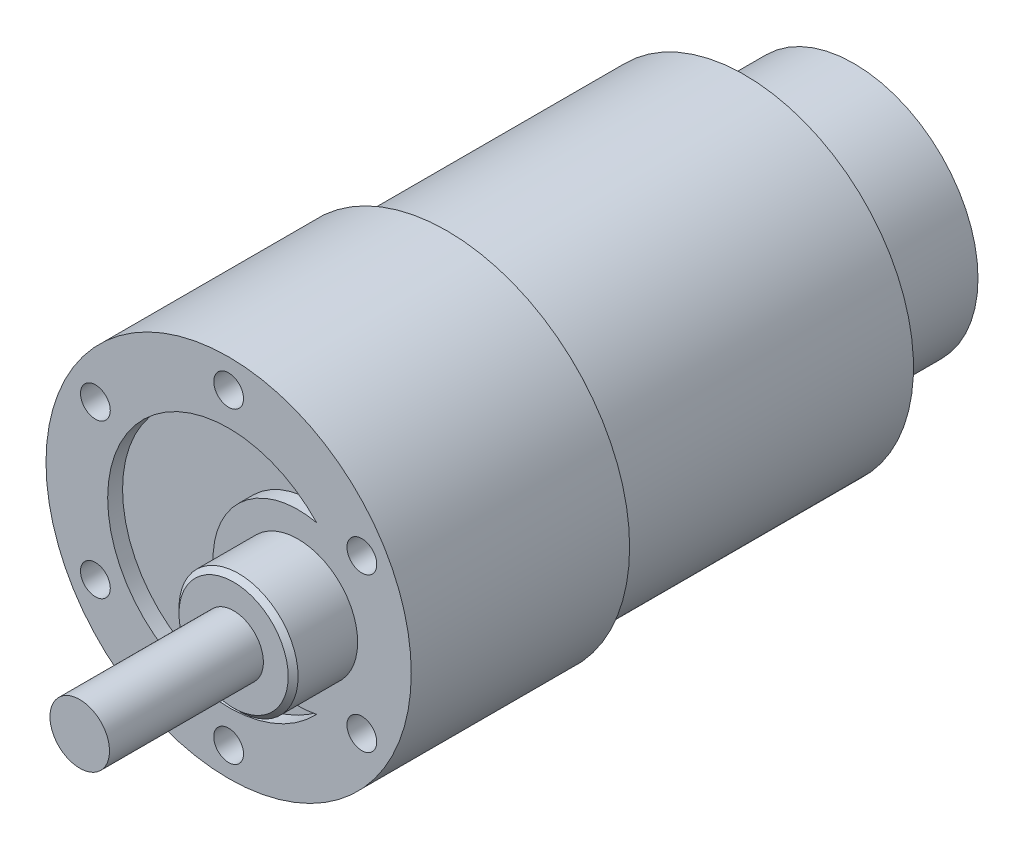
ISO-10303-21;
HEADER;
FILE_DESCRIPTION(('STEP AP214'),'2;1');
FILE_NAME('part.step','',(''),(''),'','','');
FILE_SCHEMA(('AUTOMOTIVE_DESIGN { 1 0 10303 214 1 1 1 1 }'));
ENDSEC;
DATA;
#1=APPLICATION_CONTEXT('core data for automotive mechanical design processes');
#2=APPLICATION_PROTOCOL_DEFINITION('international standard','automotive_design',2000,#1);
#3=PRODUCT_CONTEXT('',#1,'mechanical');
#4=PRODUCT('Part','Part','',(#3));
#5=PRODUCT_RELATED_PRODUCT_CATEGORY('part','',(#4));
#6=PRODUCT_DEFINITION_FORMATION('','',#4);
#7=PRODUCT_DEFINITION_CONTEXT('part definition',#1,'design');
#8=PRODUCT_DEFINITION('design','',#6,#7);
#9=PRODUCT_DEFINITION_SHAPE('','',#8);
#10=(LENGTH_UNIT() NAMED_UNIT(*) SI_UNIT(.MILLI.,.METRE.));
#11=(NAMED_UNIT(*) PLANE_ANGLE_UNIT() SI_UNIT($,.RADIAN.));
#12=(NAMED_UNIT(*) SI_UNIT($,.STERADIAN.) SOLID_ANGLE_UNIT());
#13=UNCERTAINTY_MEASURE_WITH_UNIT(LENGTH_MEASURE(1.E-05),#10,'distance_accuracy_value','');
#14=(GEOMETRIC_REPRESENTATION_CONTEXT(3) GLOBAL_UNCERTAINTY_ASSIGNED_CONTEXT((#13)) GLOBAL_UNIT_ASSIGNED_CONTEXT((#10,
#11,#12)) REPRESENTATION_CONTEXT('',''));
#15=CARTESIAN_POINT('',(0.,0.,0.));
#16=DIRECTION('',(0.,0.,1.));
#17=DIRECTION('',(1.,0.,0.));
#18=AXIS2_PLACEMENT_3D('',#15,#16,#17);
#19=CARTESIAN_POINT('',(0.,0.,0.));
#20=DIRECTION('',(0.,0.,-1.));
#21=DIRECTION('',(-1.,0.,0.));
#22=AXIS2_PLACEMENT_3D('',#19,#20,#21);
#23=PLANE('',#22);
#24=CARTESIAN_POINT('',(0.,0.,0.));
#25=DIRECTION('',(0.,0.,-1.));
#26=DIRECTION('',(-1.,0.,0.));
#27=AXIS2_PLACEMENT_3D('',#24,#25,#26);
#28=CIRCLE('',#27,17.);
#29=CARTESIAN_POINT('',(-17.,0.,0.));
#30=VERTEX_POINT('',#29);
#31=EDGE_CURVE('E88',#30,#30,#28,.T.);
#32=ORIENTED_EDGE('',*,*,#31,.T.);
#33=EDGE_LOOP('',(#32));
#34=FACE_BOUND('',#33,.T.);
#35=CARTESIAN_POINT('',(0.,0.,0.));
#36=DIRECTION('',(0.,0.,-1.));
#37=DIRECTION('',(-1.,0.,0.));
#38=AXIS2_PLACEMENT_3D('',#35,#36,#37);
#39=CIRCLE('',#38,12.5);
#40=CARTESIAN_POINT('',(-12.5,0.,0.));
#41=VERTEX_POINT('',#40);
#42=EDGE_CURVE('E65',#41,#41,#39,.T.);
#43=ORIENTED_EDGE('',*,*,#42,.F.);
#44=EDGE_LOOP('',(#43));
#45=FACE_BOUND('',#44,.T.);
#46=ADVANCED_FACE('F34',(#34,#45),#23,.T.);
#47=CARTESIAN_POINT('',(0.,0.,52.));
#48=DIRECTION('',(0.,0.,-1.));
#49=DIRECTION('',(-1.,0.,0.));
#50=AXIS2_PLACEMENT_3D('',#47,#48,#49);
#51=CYLINDRICAL_SURFACE('',#50,18.4);
#52=CARTESIAN_POINT('',(0.,0.,52.));
#53=DIRECTION('',(0.,0.,-1.));
#54=DIRECTION('',(-1.,0.,0.));
#55=AXIS2_PLACEMENT_3D('',#52,#53,#54);
#56=CIRCLE('',#55,18.4);
#57=CARTESIAN_POINT('',(-18.4,0.,52.));
#58=VERTEX_POINT('',#57);
#59=EDGE_CURVE('E102',#58,#58,#56,.T.);
#60=ORIENTED_EDGE('',*,*,#59,.T.);
#61=EDGE_LOOP('',(#60));
#62=FACE_BOUND('',#61,.T.);
#63=CARTESIAN_POINT('',(0.,0.,30.));
#64=DIRECTION('',(0.,0.,-1.));
#65=DIRECTION('',(-1.,0.,0.));
#66=AXIS2_PLACEMENT_3D('',#63,#64,#65);
#67=CIRCLE('',#66,18.4);
#68=CARTESIAN_POINT('',(-18.4,0.,30.));
#69=VERTEX_POINT('',#68);
#70=EDGE_CURVE('E93',#69,#69,#67,.T.);
#71=ORIENTED_EDGE('',*,*,#70,.F.);
#72=EDGE_LOOP('',(#71));
#73=FACE_BOUND('',#72,.T.);
#74=ADVANCED_FACE('F124',(#62,#73),#51,.T.);
#75=CARTESIAN_POINT('',(18.4,0.,52.));
#76=DIRECTION('',(0.,0.,1.));
#77=DIRECTION('',(1.,0.,0.));
#78=AXIS2_PLACEMENT_3D('',#75,#76,#77);
#79=PLANE('',#78);
#80=CARTESIAN_POINT('',(-13.4233937586587,7.75000000000016,52.));
#81=DIRECTION('',(0.,0.,1.));
#82=DIRECTION('',(1.,0.,0.));
#83=AXIS2_PLACEMENT_3D('',#80,#81,#82);
#84=CIRCLE('',#83,1.49999999999999);
#85=CARTESIAN_POINT('',(-11.9233937586587,7.75000000000016,52.));
#86=VERTEX_POINT('',#85);
#87=EDGE_CURVE('E155',#86,#86,#84,.T.);
#88=ORIENTED_EDGE('',*,*,#87,.F.);
#89=EDGE_LOOP('',(#88));
#90=FACE_BOUND('',#89,.T.);
#91=CARTESIAN_POINT('',(-13.4233937586589,-7.74999999999987,52.));
#92=DIRECTION('',(0.,0.,1.));
#93=DIRECTION('',(1.,0.,0.));
#94=AXIS2_PLACEMENT_3D('',#91,#92,#93);
#95=CIRCLE('',#94,1.49999999999999);
#96=CARTESIAN_POINT('',(-11.9233937586589,-7.74999999999987,52.));
#97=VERTEX_POINT('',#96);
#98=EDGE_CURVE('E159',#97,#97,#95,.T.);
#99=ORIENTED_EDGE('',*,*,#98,.F.);
#100=EDGE_LOOP('',(#99));
#101=FACE_BOUND('',#100,.T.);
#102=CARTESIAN_POINT('',(-1.08235921504137E-13,-15.5,52.));
#103=DIRECTION('',(0.,0.,1.));
#104=DIRECTION('',(1.,0.,0.));
#105=AXIS2_PLACEMENT_3D('',#102,#103,#104);
#106=CIRCLE('',#105,1.49999999999999);
#107=CARTESIAN_POINT('',(1.49999999999988,-15.5,52.));
#108=VERTEX_POINT('',#107);
#109=EDGE_CURVE('E163',#108,#108,#106,.T.);
#110=ORIENTED_EDGE('',*,*,#109,.F.);
#111=EDGE_LOOP('',(#110));
#112=FACE_BOUND('',#111,.T.);
#113=CARTESIAN_POINT('',(13.4233937586588,-7.75000000000006,52.));
#114=DIRECTION('',(0.,0.,1.));
#115=DIRECTION('',(1.,0.,0.));
#116=AXIS2_PLACEMENT_3D('',#113,#114,#115);
#117=CIRCLE('',#116,1.49999999999999);
#118=CARTESIAN_POINT('',(14.9233937586588,-7.75000000000006,52.));
#119=VERTEX_POINT('',#118);
#120=EDGE_CURVE('E167',#119,#119,#117,.T.);
#121=ORIENTED_EDGE('',*,*,#120,.F.);
#122=EDGE_LOOP('',(#121));
#123=FACE_BOUND('',#122,.T.);
#124=CARTESIAN_POINT('',(13.4233937586588,7.74999999999997,52.));
#125=DIRECTION('',(0.,0.,1.));
#126=DIRECTION('',(1.,0.,0.));
#127=AXIS2_PLACEMENT_3D('',#124,#125,#126);
#128=CIRCLE('',#127,1.49999999999999);
#129=CARTESIAN_POINT('',(14.9233937586588,7.74999999999997,52.));
#130=VERTEX_POINT('',#129);
#131=EDGE_CURVE('E171',#130,#130,#128,.T.);
#132=ORIENTED_EDGE('',*,*,#131,.F.);
#133=EDGE_LOOP('',(#132));
#134=FACE_BOUND('',#133,.T.);
#135=CARTESIAN_POINT('',(0.,15.5,52.));
#136=DIRECTION('',(0.,0.,1.));
#137=DIRECTION('',(1.,0.,0.));
#138=AXIS2_PLACEMENT_3D('',#135,#136,#137);
#139=CIRCLE('',#138,1.49999999999999);
#140=CARTESIAN_POINT('',(1.49999999999999,15.5,52.));
#141=VERTEX_POINT('',#140);
#142=EDGE_CURVE('E175',#141,#141,#139,.T.);
#143=ORIENTED_EDGE('',*,*,#142,.F.);
#144=EDGE_LOOP('',(#143));
#145=FACE_BOUND('',#144,.T.);
#146=CARTESIAN_POINT('',(7.,0.,52.));
#147=DIRECTION('',(0.,0.,1.));
#148=DIRECTION('',(1.,0.,0.));
#149=AXIS2_PLACEMENT_3D('',#146,#147,#148);
#150=CIRCLE('',#149,6.);
#151=CARTESIAN_POINT('',(13.,0.,52.));
#152=VERTEX_POINT('',#151);
#153=EDGE_CURVE('E105',#152,#152,#150,.T.);
#154=ORIENTED_EDGE('',*,*,#153,.F.);
#155=EDGE_LOOP('',(#154));
#156=FACE_BOUND('',#155,.T.);
#157=CARTESIAN_POINT('',(7.,0.,52.));
#158=DIRECTION('',(0.,0.,-1.));
#159=DIRECTION('',(-1.,0.,0.));
#160=AXIS2_PLACEMENT_3D('',#157,#158,#159);
#161=CIRCLE('',#160,8.56590718111272);
#162=CARTESIAN_POINT('',(8.86813473528428,-8.35971521322723,52.));
#163=VERTEX_POINT('',#162);
#164=CARTESIAN_POINT('',(8.86813473528428,8.35971521322723,52.));
#165=VERTEX_POINT('',#164);
#166=EDGE_CURVE('E49',#163,#165,#161,.T.);
#167=ORIENTED_EDGE('',*,*,#166,.F.);
#168=CARTESIAN_POINT('',(0.,0.,52.));
#169=DIRECTION('',(0.,0.,1.));
#170=DIRECTION('',(1.,0.,0.));
#171=AXIS2_PLACEMENT_3D('',#168,#169,#170);
#172=CIRCLE('',#171,12.1872331613627);
#173=EDGE_CURVE('E69',#165,#163,#172,.T.);
#174=ORIENTED_EDGE('',*,*,#173,.F.);
#175=EDGE_LOOP('',(#167,#174));
#176=FACE_BOUND('',#175,.T.);
#177=ORIENTED_EDGE('',*,*,#59,.F.);
#178=EDGE_LOOP('',(#177));
#179=FACE_BOUND('',#178,.T.);
#180=ADVANCED_FACE('F73',(#90,#101,#112,#123,#134,#145,#156,#176,#179),#79,.T.);
#181=CARTESIAN_POINT('',(0.,0.,29.));
#182=DIRECTION('',(0.,0.,-1.));
#183=DIRECTION('',(-1.,0.,0.));
#184=AXIS2_PLACEMENT_3D('',#181,#182,#183);
#185=TOROIDAL_SURFACE('',#184,16.,1.);
#186=CARTESIAN_POINT('',(0.,0.,30.));
#187=DIRECTION('',(0.,0.,-1.));
#188=DIRECTION('',(-1.,0.,0.));
#189=AXIS2_PLACEMENT_3D('',#186,#187,#188);
#190=CIRCLE('',#189,16.);
#191=CARTESIAN_POINT('',(-16.,0.,30.));
#192=VERTEX_POINT('',#191);
#193=EDGE_CURVE('E96',#192,#192,#190,.T.);
#194=ORIENTED_EDGE('',*,*,#193,.T.);
#195=EDGE_LOOP('',(#194));
#196=FACE_BOUND('',#195,.T.);
#197=CARTESIAN_POINT('',(0.,0.,29.));
#198=DIRECTION('',(0.,0.,-1.));
#199=DIRECTION('',(-1.,0.,0.));
#200=AXIS2_PLACEMENT_3D('',#197,#198,#199);
#201=CIRCLE('',#200,17.);
#202=CARTESIAN_POINT('',(-17.,0.,29.));
#203=VERTEX_POINT('',#202);
#204=EDGE_CURVE('E99',#203,#203,#201,.T.);
#205=ORIENTED_EDGE('',*,*,#204,.F.);
#206=EDGE_LOOP('',(#205));
#207=FACE_BOUND('',#206,.T.);
#208=ADVANCED_FACE('F143',(#196,#207),#185,.T.);
#209=CARTESIAN_POINT('',(16.,0.,30.));
#210=DIRECTION('',(0.,0.,-1.));
#211=DIRECTION('',(-1.,0.,0.));
#212=AXIS2_PLACEMENT_3D('',#209,#210,#211);
#213=PLANE('',#212);
#214=ORIENTED_EDGE('',*,*,#70,.T.);
#215=EDGE_LOOP('',(#214));
#216=FACE_BOUND('',#215,.T.);
#217=ORIENTED_EDGE('',*,*,#193,.F.);
#218=EDGE_LOOP('',(#217));
#219=FACE_BOUND('',#218,.T.);
#220=ADVANCED_FACE('F139',(#216,#219),#213,.T.);
#221=CARTESIAN_POINT('',(0.,0.,0.));
#222=DIRECTION('',(0.,0.,1.));
#223=DIRECTION('',(1.,0.,0.));
#224=AXIS2_PLACEMENT_3D('',#221,#222,#223);
#225=CYLINDRICAL_SURFACE('',#224,17.);
#226=ORIENTED_EDGE('',*,*,#31,.F.);
#227=EDGE_LOOP('',(#226));
#228=FACE_BOUND('',#227,.T.);
#229=ORIENTED_EDGE('',*,*,#204,.T.);
#230=EDGE_LOOP('',(#229));
#231=FACE_BOUND('',#230,.T.);
#232=ADVANCED_FACE('F136',(#228,#231),#225,.T.);
#233=CARTESIAN_POINT('',(0.,0.,-11.));
#234=DIRECTION('',(0.,0.,1.));
#235=DIRECTION('',(1.,0.,0.));
#236=AXIS2_PLACEMENT_3D('',#233,#234,#235);
#237=CYLINDRICAL_SURFACE('',#236,12.5);
#238=CARTESIAN_POINT('',(0.,0.,-11.));
#239=DIRECTION('',(0.,0.,-1.));
#240=DIRECTION('',(-1.,0.,0.));
#241=AXIS2_PLACEMENT_3D('',#238,#239,#240);
#242=CIRCLE('',#241,12.5);
#243=CARTESIAN_POINT('',(-12.5,0.,-11.));
#244=VERTEX_POINT('',#243);
#245=EDGE_CURVE('E85',#244,#244,#242,.T.);
#246=ORIENTED_EDGE('',*,*,#245,.F.);
#247=EDGE_LOOP('',(#246));
#248=FACE_BOUND('',#247,.T.);
#249=ORIENTED_EDGE('',*,*,#42,.T.);
#250=EDGE_LOOP('',(#249));
#251=FACE_BOUND('',#250,.T.);
#252=ADVANCED_FACE('F134',(#248,#251),#237,.T.);
#253=CARTESIAN_POINT('',(0.,0.,-11.));
#254=DIRECTION('',(0.,0.,-1.));
#255=DIRECTION('',(-1.,0.,0.));
#256=AXIS2_PLACEMENT_3D('',#253,#254,#255);
#257=PLANE('',#256);
#258=ORIENTED_EDGE('',*,*,#245,.T.);
#259=EDGE_LOOP('',(#258));
#260=FACE_BOUND('',#259,.T.);
#261=ADVANCED_FACE('F203',(#260),#257,.T.);
#262=CARTESIAN_POINT('',(7.,0.,50.5));
#263=DIRECTION('',(0.,0.,1.));
#264=DIRECTION('',(1.,0.,0.));
#265=AXIS2_PLACEMENT_3D('',#262,#263,#264);
#266=CYLINDRICAL_SURFACE('',#265,8.56590718111272);
#267=ORIENTED_EDGE('',*,*,#166,.T.);
#268=DIRECTION('',(0.,0.,1.));
#269=VECTOR('',#268,1.);
#270=CARTESIAN_POINT('',(8.86813473528428,8.35971521322723,50.5));
#271=LINE('',#270,#269);
#272=CARTESIAN_POINT('',(8.86813473528428,8.35971521322723,50.5));
#273=VERTEX_POINT('',#272);
#274=EDGE_CURVE('E66',#273,#165,#271,.T.);
#275=ORIENTED_EDGE('',*,*,#274,.F.);
#276=CARTESIAN_POINT('',(7.,0.,50.5));
#277=DIRECTION('',(0.,0.,-1.));
#278=DIRECTION('',(-1.,0.,0.));
#279=AXIS2_PLACEMENT_3D('',#276,#277,#278);
#280=CIRCLE('',#279,8.56590718111272);
#281=CARTESIAN_POINT('',(8.86813473528428,-8.35971521322723,50.5));
#282=VERTEX_POINT('',#281);
#283=EDGE_CURVE('E63',#282,#273,#280,.T.);
#284=ORIENTED_EDGE('',*,*,#283,.F.);
#285=DIRECTION('',(0.,0.,1.));
#286=VECTOR('',#285,1.);
#287=CARTESIAN_POINT('',(8.86813473528428,-8.35971521322723,50.5));
#288=LINE('',#287,#286);
#289=EDGE_CURVE('E57',#282,#163,#288,.T.);
#290=ORIENTED_EDGE('',*,*,#289,.T.);
#291=EDGE_LOOP('',(#267,#275,#284,#290));
#292=FACE_BOUND('',#291,.T.);
#293=ADVANCED_FACE('F61',(#292),#266,.T.);
#294=CARTESIAN_POINT('',(0.,0.,50.5));
#295=DIRECTION('',(0.,0.,1.));
#296=DIRECTION('',(1.,0.,0.));
#297=AXIS2_PLACEMENT_3D('',#294,#295,#296);
#298=CYLINDRICAL_SURFACE('',#297,12.1872331613627);
#299=ORIENTED_EDGE('',*,*,#173,.T.);
#300=ORIENTED_EDGE('',*,*,#289,.F.);
#301=CARTESIAN_POINT('',(0.,0.,50.5));
#302=DIRECTION('',(0.,0.,1.));
#303=DIRECTION('',(1.,0.,0.));
#304=AXIS2_PLACEMENT_3D('',#301,#302,#303);
#305=CIRCLE('',#304,12.1872331613627);
#306=EDGE_CURVE('E81',#273,#282,#305,.T.);
#307=ORIENTED_EDGE('',*,*,#306,.F.);
#308=ORIENTED_EDGE('',*,*,#274,.T.);
#309=EDGE_LOOP('',(#299,#300,#307,#308));
#310=FACE_BOUND('',#309,.T.);
#311=ADVANCED_FACE('F70',(#310),#298,.F.);
#312=CARTESIAN_POINT('',(3.5,0.,50.5));
#313=DIRECTION('',(0.,0.,-1.));
#314=DIRECTION('',(-1.,0.,0.));
#315=AXIS2_PLACEMENT_3D('',#312,#313,#314);
#316=PLANE('',#315);
#317=ORIENTED_EDGE('',*,*,#283,.T.);
#318=ORIENTED_EDGE('',*,*,#306,.T.);
#319=EDGE_LOOP('',(#317,#318));
#320=FACE_BOUND('',#319,.T.);
#321=ADVANCED_FACE('F195',(#320),#316,.F.);
#322=CARTESIAN_POINT('',(7.,0.,74.));
#323=DIRECTION('',(0.,0.,-1.));
#324=DIRECTION('',(-1.,0.,0.));
#325=AXIS2_PLACEMENT_3D('',#322,#323,#324);
#326=CYLINDRICAL_SURFACE('',#325,3.);
#327=CARTESIAN_POINT('',(7.,0.,74.));
#328=DIRECTION('',(0.,0.,-1.));
#329=DIRECTION('',(-1.,0.,0.));
#330=AXIS2_PLACEMENT_3D('',#327,#328,#329);
#331=CIRCLE('',#330,3.);
#332=CARTESIAN_POINT('',(4.,0.,74.));
#333=VERTEX_POINT('',#332);
#334=EDGE_CURVE('E75',#333,#333,#331,.T.);
#335=ORIENTED_EDGE('',*,*,#334,.T.);
#336=EDGE_LOOP('',(#335));
#337=FACE_BOUND('',#336,.T.);
#338=CARTESIAN_POINT('',(7.,0.,58.5));
#339=DIRECTION('',(0.,0.,-1.));
#340=DIRECTION('',(-1.,0.,0.));
#341=AXIS2_PLACEMENT_3D('',#338,#339,#340);
#342=CIRCLE('',#341,3.);
#343=CARTESIAN_POINT('',(4.,0.,58.5));
#344=VERTEX_POINT('',#343);
#345=EDGE_CURVE('E78',#344,#344,#342,.T.);
#346=ORIENTED_EDGE('',*,*,#345,.F.);
#347=EDGE_LOOP('',(#346));
#348=FACE_BOUND('',#347,.T.);
#349=ADVANCED_FACE('F188',(#337,#348),#326,.T.);
#350=CARTESIAN_POINT('',(10.,0.,74.));
#351=DIRECTION('',(0.,0.,1.));
#352=DIRECTION('',(1.,0.,0.));
#353=AXIS2_PLACEMENT_3D('',#350,#351,#352);
#354=PLANE('',#353);
#355=ORIENTED_EDGE('',*,*,#334,.F.);
#356=EDGE_LOOP('',(#355));
#357=FACE_BOUND('',#356,.T.);
#358=ADVANCED_FACE('F179',(#357),#354,.T.);
#359=CARTESIAN_POINT('',(7.,0.,74.));
#360=DIRECTION('',(0.,0.,-1.));
#361=DIRECTION('',(-1.,0.,0.));
#362=AXIS2_PLACEMENT_3D('',#359,#360,#361);
#363=CYLINDRICAL_SURFACE('',#362,6.);
#364=CARTESIAN_POINT('',(7.,0.,57.9999999999705));
#365=DIRECTION('',(0.,0.,1.));
#366=DIRECTION('',(1.,0.,0.));
#367=AXIS2_PLACEMENT_3D('',#364,#365,#366);
#368=CIRCLE('',#367,6.);
#369=CARTESIAN_POINT('',(13.,0.,57.9999999999705));
#370=VERTEX_POINT('',#369);
#371=EDGE_CURVE('E42',#370,#370,#368,.F.);
#372=ORIENTED_EDGE('',*,*,#371,.T.);
#373=EDGE_LOOP('',(#372));
#374=FACE_BOUND('',#373,.T.);
#375=ORIENTED_EDGE('',*,*,#153,.T.);
#376=EDGE_LOOP('',(#375));
#377=FACE_BOUND('',#376,.T.);
#378=ADVANCED_FACE('F110',(#374,#377),#363,.T.);
#379=CARTESIAN_POINT('',(13.,0.,58.5));
#380=DIRECTION('',(0.,0.,1.));
#381=DIRECTION('',(1.,0.,0.));
#382=AXIS2_PLACEMENT_3D('',#379,#380,#381);
#383=PLANE('',#382);
#384=CARTESIAN_POINT('',(7.,0.,58.5));
#385=DIRECTION('',(0.,0.,1.));
#386=DIRECTION('',(1.,0.,0.));
#387=AXIS2_PLACEMENT_3D('',#384,#385,#386);
#388=CIRCLE('',#387,5.50000000002732);
#389=CARTESIAN_POINT('',(12.5000000000273,0.,58.5));
#390=VERTEX_POINT('',#389);
#391=EDGE_CURVE('E11',#390,#390,#388,.T.);
#392=ORIENTED_EDGE('',*,*,#391,.T.);
#393=EDGE_LOOP('',(#392));
#394=FACE_BOUND('',#393,.T.);
#395=ORIENTED_EDGE('',*,*,#345,.T.);
#396=EDGE_LOOP('',(#395));
#397=FACE_BOUND('',#396,.T.);
#398=ADVANCED_FACE('F178',(#394,#397),#383,.T.);
#399=CARTESIAN_POINT('',(0.,15.5,49.));
#400=DIRECTION('',(0.,0.,-1.));
#401=DIRECTION('',(-1.,0.,0.));
#402=AXIS2_PLACEMENT_3D('',#399,#400,#401);
#403=PLANE('',#402);
#404=CARTESIAN_POINT('',(0.,15.5,49.));
#405=DIRECTION('',(0.,0.,1.));
#406=DIRECTION('',(1.,0.,0.));
#407=AXIS2_PLACEMENT_3D('',#404,#405,#406);
#408=CIRCLE('',#407,1.49999999999999);
#409=CARTESIAN_POINT('',(1.49999999999999,15.5,49.));
#410=VERTEX_POINT('',#409);
#411=EDGE_CURVE('E435',#410,#410,#408,.T.);
#412=ORIENTED_EDGE('',*,*,#411,.T.);
#413=EDGE_LOOP('',(#412));
#414=FACE_BOUND('',#413,.T.);
#415=ADVANCED_FACE('F185',(#414),#403,.F.);
#416=CARTESIAN_POINT('',(0.,15.5,52.));
#417=DIRECTION('',(0.,0.,1.));
#418=DIRECTION('',(1.,0.,0.));
#419=AXIS2_PLACEMENT_3D('',#416,#417,#418);
#420=CYLINDRICAL_SURFACE('',#419,1.49999999999999);
#421=ORIENTED_EDGE('',*,*,#411,.F.);
#422=EDGE_LOOP('',(#421));
#423=FACE_BOUND('',#422,.T.);
#424=ORIENTED_EDGE('',*,*,#142,.T.);
#425=EDGE_LOOP('',(#424));
#426=FACE_BOUND('',#425,.T.);
#427=ADVANCED_FACE('F250',(#423,#426),#420,.F.);
#428=CARTESIAN_POINT('',(13.4233937586588,7.74999999999997,49.));
#429=DIRECTION('',(0.,0.,-1.));
#430=DIRECTION('',(-1.,0.,0.));
#431=AXIS2_PLACEMENT_3D('',#428,#429,#430);
#432=PLANE('',#431);
#433=CARTESIAN_POINT('',(13.4233937586588,7.74999999999997,49.));
#434=DIRECTION('',(0.,0.,1.));
#435=DIRECTION('',(1.,0.,0.));
#436=AXIS2_PLACEMENT_3D('',#433,#434,#435);
#437=CIRCLE('',#436,1.49999999999999);
#438=CARTESIAN_POINT('',(14.9233937586588,7.74999999999997,49.));
#439=VERTEX_POINT('',#438);
#440=EDGE_CURVE('E431',#439,#439,#437,.T.);
#441=ORIENTED_EDGE('',*,*,#440,.T.);
#442=EDGE_LOOP('',(#441));
#443=FACE_BOUND('',#442,.T.);
#444=ADVANCED_FACE('F260',(#443),#432,.F.);
#445=CARTESIAN_POINT('',(13.4233937586588,7.74999999999997,52.));
#446=DIRECTION('',(0.,0.,1.));
#447=DIRECTION('',(1.,0.,0.));
#448=AXIS2_PLACEMENT_3D('',#445,#446,#447);
#449=CYLINDRICAL_SURFACE('',#448,1.49999999999999);
#450=ORIENTED_EDGE('',*,*,#440,.F.);
#451=EDGE_LOOP('',(#450));
#452=FACE_BOUND('',#451,.T.);
#453=ORIENTED_EDGE('',*,*,#131,.T.);
#454=EDGE_LOOP('',(#453));
#455=FACE_BOUND('',#454,.T.);
#456=ADVANCED_FACE('F270',(#452,#455),#449,.F.);
#457=CARTESIAN_POINT('',(13.4233937586588,-7.75000000000006,49.));
#458=DIRECTION('',(0.,0.,-1.));
#459=DIRECTION('',(-1.,0.,0.));
#460=AXIS2_PLACEMENT_3D('',#457,#458,#459);
#461=PLANE('',#460);
#462=CARTESIAN_POINT('',(13.4233937586588,-7.75000000000006,49.));
#463=DIRECTION('',(0.,0.,1.));
#464=DIRECTION('',(1.,0.,0.));
#465=AXIS2_PLACEMENT_3D('',#462,#463,#464);
#466=CIRCLE('',#465,1.49999999999999);
#467=CARTESIAN_POINT('',(14.9233937586588,-7.75000000000006,49.));
#468=VERTEX_POINT('',#467);
#469=EDGE_CURVE('E427',#468,#468,#466,.T.);
#470=ORIENTED_EDGE('',*,*,#469,.T.);
#471=EDGE_LOOP('',(#470));
#472=FACE_BOUND('',#471,.T.);
#473=ADVANCED_FACE('F280',(#472),#461,.F.);
#474=CARTESIAN_POINT('',(13.4233937586588,-7.75000000000006,52.));
#475=DIRECTION('',(0.,0.,1.));
#476=DIRECTION('',(1.,0.,0.));
#477=AXIS2_PLACEMENT_3D('',#474,#475,#476);
#478=CYLINDRICAL_SURFACE('',#477,1.49999999999999);
#479=ORIENTED_EDGE('',*,*,#469,.F.);
#480=EDGE_LOOP('',(#479));
#481=FACE_BOUND('',#480,.T.);
#482=ORIENTED_EDGE('',*,*,#120,.T.);
#483=EDGE_LOOP('',(#482));
#484=FACE_BOUND('',#483,.T.);
#485=ADVANCED_FACE('F290',(#481,#484),#478,.F.);
#486=CARTESIAN_POINT('',(-1.08970709583626E-13,-15.5,49.));
#487=DIRECTION('',(0.,0.,-1.));
#488=DIRECTION('',(-1.,0.,0.));
#489=AXIS2_PLACEMENT_3D('',#486,#487,#488);
#490=PLANE('',#489);
#491=CARTESIAN_POINT('',(-1.08235921504137E-13,-15.5,49.));
#492=DIRECTION('',(0.,0.,1.));
#493=DIRECTION('',(1.,0.,0.));
#494=AXIS2_PLACEMENT_3D('',#491,#492,#493);
#495=CIRCLE('',#494,1.49999999999999);
#496=CARTESIAN_POINT('',(1.49999999999988,-15.5,49.));
#497=VERTEX_POINT('',#496);
#498=EDGE_CURVE('E423',#497,#497,#495,.T.);
#499=ORIENTED_EDGE('',*,*,#498,.T.);
#500=EDGE_LOOP('',(#499));
#501=FACE_BOUND('',#500,.T.);
#502=ADVANCED_FACE('F300',(#501),#490,.F.);
#503=CARTESIAN_POINT('',(-1.08235921504137E-13,-15.5,52.));
#504=DIRECTION('',(0.,0.,1.));
#505=DIRECTION('',(1.,0.,0.));
#506=AXIS2_PLACEMENT_3D('',#503,#504,#505);
#507=CYLINDRICAL_SURFACE('',#506,1.49999999999999);
#508=ORIENTED_EDGE('',*,*,#498,.F.);
#509=EDGE_LOOP('',(#508));
#510=FACE_BOUND('',#509,.T.);
#511=ORIENTED_EDGE('',*,*,#109,.T.);
#512=EDGE_LOOP('',(#511));
#513=FACE_BOUND('',#512,.T.);
#514=ADVANCED_FACE('F310',(#510,#513),#507,.F.);
#515=CARTESIAN_POINT('',(-13.4233937586589,-7.74999999999987,49.));
#516=DIRECTION('',(0.,0.,-1.));
#517=DIRECTION('',(-1.,0.,0.));
#518=AXIS2_PLACEMENT_3D('',#515,#516,#517);
#519=PLANE('',#518);
#520=CARTESIAN_POINT('',(-13.4233937586589,-7.74999999999987,49.));
#521=DIRECTION('',(0.,0.,1.));
#522=DIRECTION('',(1.,0.,0.));
#523=AXIS2_PLACEMENT_3D('',#520,#521,#522);
#524=CIRCLE('',#523,1.49999999999999);
#525=CARTESIAN_POINT('',(-11.9233937586589,-7.74999999999987,49.));
#526=VERTEX_POINT('',#525);
#527=EDGE_CURVE('E416',#526,#526,#524,.T.);
#528=ORIENTED_EDGE('',*,*,#527,.T.);
#529=EDGE_LOOP('',(#528));
#530=FACE_BOUND('',#529,.T.);
#531=ADVANCED_FACE('F320',(#530),#519,.F.);
#532=CARTESIAN_POINT('',(-13.4233937586589,-7.74999999999987,52.));
#533=DIRECTION('',(0.,0.,1.));
#534=DIRECTION('',(1.,0.,0.));
#535=AXIS2_PLACEMENT_3D('',#532,#533,#534);
#536=CYLINDRICAL_SURFACE('',#535,1.49999999999999);
#537=ORIENTED_EDGE('',*,*,#527,.F.);
#538=EDGE_LOOP('',(#537));
#539=FACE_BOUND('',#538,.T.);
#540=ORIENTED_EDGE('',*,*,#98,.T.);
#541=EDGE_LOOP('',(#540));
#542=FACE_BOUND('',#541,.T.);
#543=ADVANCED_FACE('F330',(#539,#542),#536,.F.);
#544=CARTESIAN_POINT('',(-13.4233937586587,7.75000000000016,49.));
#545=DIRECTION('',(0.,0.,-1.));
#546=DIRECTION('',(-1.,0.,0.));
#547=AXIS2_PLACEMENT_3D('',#544,#545,#546);
#548=PLANE('',#547);
#549=CARTESIAN_POINT('',(-13.4233937586587,7.75000000000016,49.));
#550=DIRECTION('',(0.,0.,1.));
#551=DIRECTION('',(1.,0.,0.));
#552=AXIS2_PLACEMENT_3D('',#549,#550,#551);
#553=CIRCLE('',#552,1.49999999999999);
#554=CARTESIAN_POINT('',(-11.9233937586587,7.75000000000016,49.));
#555=VERTEX_POINT('',#554);
#556=EDGE_CURVE('E414',#555,#555,#553,.T.);
#557=ORIENTED_EDGE('',*,*,#556,.T.);
#558=EDGE_LOOP('',(#557));
#559=FACE_BOUND('',#558,.T.);
#560=ADVANCED_FACE('F119',(#559),#548,.F.);
#561=CARTESIAN_POINT('',(-13.4233937586587,7.75000000000016,52.));
#562=DIRECTION('',(0.,0.,1.));
#563=DIRECTION('',(1.,0.,0.));
#564=AXIS2_PLACEMENT_3D('',#561,#562,#563);
#565=CYLINDRICAL_SURFACE('',#564,1.49999999999999);
#566=ORIENTED_EDGE('',*,*,#556,.F.);
#567=EDGE_LOOP('',(#566));
#568=FACE_BOUND('',#567,.T.);
#569=ORIENTED_EDGE('',*,*,#87,.T.);
#570=EDGE_LOOP('',(#569));
#571=FACE_BOUND('',#570,.T.);
#572=ADVANCED_FACE('F114',(#568,#571),#565,.F.);
#573=CARTESIAN_POINT('',(7.,0.,57.9999999999705));
#574=DIRECTION('',(0.,0.,-1.));
#575=DIRECTION('',(-1.,0.,0.));
#576=AXIS2_PLACEMENT_3D('',#573,#574,#575);
#577=CONICAL_SURFACE('',#576,6.,0.785398163340608);
#578=ORIENTED_EDGE('',*,*,#391,.F.);
#579=EDGE_LOOP('',(#578));
#580=FACE_BOUND('',#579,.T.);
#581=ORIENTED_EDGE('',*,*,#371,.F.);
#582=EDGE_LOOP('',(#581));
#583=FACE_BOUND('',#582,.T.);
#584=ADVANCED_FACE('F36',(#580,#583),#577,.T.);
#585=CLOSED_SHELL('',(#46,#74,#180,#208,#220,#232,#252,#261,#293,#311,#321,#349,#358,#378,#398,
#415,#427,#444,#456,#473,#485,#502,#514,#531,#543,#560,#572,#584));
#586=MANIFOLD_SOLID_BREP('B2',#585);
#587=ADVANCED_BREP_SHAPE_REPRESENTATION('',(#18,#586),#14);
#588=SHAPE_DEFINITION_REPRESENTATION(#9,#587);
ENDSEC;
END-ISO-10303-21;
